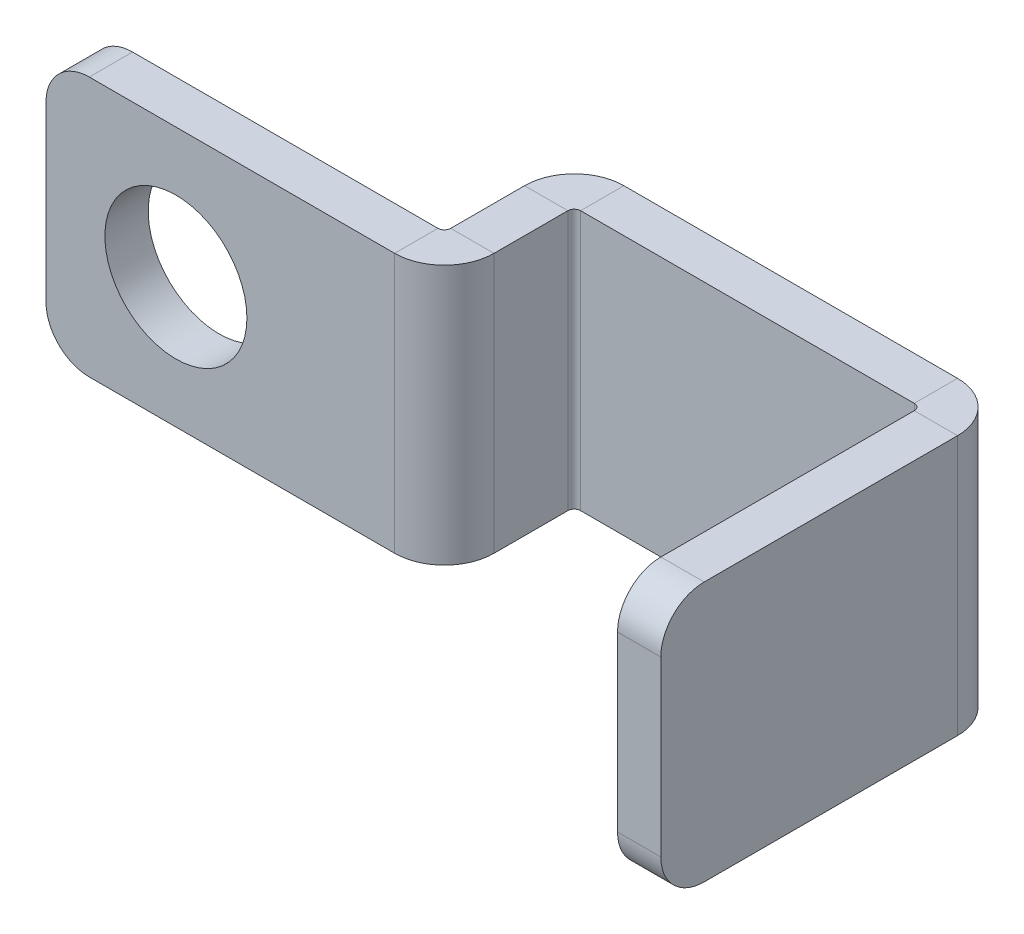
ISO-10303-21;
HEADER;
FILE_DESCRIPTION(('STEP AP214'),'2;1');
FILE_NAME('part.step','',(''),(''),'','','');
FILE_SCHEMA(('AUTOMOTIVE_DESIGN { 1 0 10303 214 1 1 1 1 }'));
ENDSEC;
DATA;
#1=APPLICATION_CONTEXT('core data for automotive mechanical design processes');
#2=APPLICATION_PROTOCOL_DEFINITION('international standard','automotive_design',2000,#1);
#3=PRODUCT_CONTEXT('',#1,'mechanical');
#4=PRODUCT('Part','Part','',(#3));
#5=PRODUCT_RELATED_PRODUCT_CATEGORY('part','',(#4));
#6=PRODUCT_DEFINITION_FORMATION('','',#4);
#7=PRODUCT_DEFINITION_CONTEXT('part definition',#1,'design');
#8=PRODUCT_DEFINITION('design','',#6,#7);
#9=PRODUCT_DEFINITION_SHAPE('','',#8);
#10=(LENGTH_UNIT() NAMED_UNIT(*) SI_UNIT(.MILLI.,.METRE.));
#11=(NAMED_UNIT(*) PLANE_ANGLE_UNIT() SI_UNIT($,.RADIAN.));
#12=(NAMED_UNIT(*) SI_UNIT($,.STERADIAN.) SOLID_ANGLE_UNIT());
#13=UNCERTAINTY_MEASURE_WITH_UNIT(LENGTH_MEASURE(1.E-05),#10,'distance_accuracy_value','');
#14=(GEOMETRIC_REPRESENTATION_CONTEXT(3) GLOBAL_UNCERTAINTY_ASSIGNED_CONTEXT((#13)) GLOBAL_UNIT_ASSIGNED_CONTEXT((#10,
#11,#12)) REPRESENTATION_CONTEXT('',''));
#15=CARTESIAN_POINT('',(0.,0.,0.));
#16=DIRECTION('',(0.,0.,1.));
#17=DIRECTION('',(1.,0.,0.));
#18=AXIS2_PLACEMENT_3D('',#15,#16,#17);
#19=CARTESIAN_POINT('',(23.,-15.,-20.));
#20=DIRECTION('',(0.,1.,0.));
#21=DIRECTION('',(0.,0.,1.));
#22=AXIS2_PLACEMENT_3D('',#19,#20,#21);
#23=PLANE('',#22);
#24=DIRECTION('',(0.,0.,-1.));
#25=VECTOR('',#24,1.);
#26=CARTESIAN_POINT('',(62.2634,-15.,-15.));
#27=LINE('',#26,#25);
#28=CARTESIAN_POINT('',(62.2634,-15.,-15.));
#29=VERTEX_POINT('',#28);
#30=CARTESIAN_POINT('',(62.2634,-15.,-20.));
#31=VERTEX_POINT('',#30);
#32=EDGE_CURVE('E297',#29,#31,#27,.T.);
#33=ORIENTED_EDGE('',*,*,#32,.F.);
#34=DIRECTION('',(1.,0.,0.));
#35=VECTOR('',#34,1.);
#36=CARTESIAN_POINT('',(23.,-15.,-15.));
#37=LINE('',#36,#35);
#38=CARTESIAN_POINT('',(23.7366,-15.,-15.));
#39=VERTEX_POINT('',#38);
#40=EDGE_CURVE('E311',#29,#39,#37,.F.);
#41=ORIENTED_EDGE('',*,*,#40,.T.);
#42=DIRECTION('',(0.,0.,1.));
#43=VECTOR('',#42,1.);
#44=CARTESIAN_POINT('',(23.7366,-15.,-20.));
#45=LINE('',#44,#43);
#46=CARTESIAN_POINT('',(23.7366,-15.,-20.));
#47=VERTEX_POINT('',#46);
#48=EDGE_CURVE('E300',#39,#47,#45,.F.);
#49=ORIENTED_EDGE('',*,*,#48,.T.);
#50=DIRECTION('',(-1.,0.,0.));
#51=VECTOR('',#50,1.);
#52=CARTESIAN_POINT('',(0.,-15.,-20.));
#53=LINE('',#52,#51);
#54=EDGE_CURVE('E306',#31,#47,#53,.T.);
#55=ORIENTED_EDGE('',*,*,#54,.F.);
#56=EDGE_LOOP('',(#33,#41,#49,#55));
#57=FACE_BOUND('',#56,.T.);
#58=ADVANCED_FACE('F97',(#57),#23,.F.);
#59=CARTESIAN_POINT('',(68.,15.,-20.));
#60=DIRECTION('',(0.,-1.,0.));
#61=DIRECTION('',(0.,0.,-1.));
#62=AXIS2_PLACEMENT_3D('',#59,#60,#61);
#63=PLANE('',#62);
#64=DIRECTION('',(0.,0.,-1.));
#65=VECTOR('',#64,1.);
#66=CARTESIAN_POINT('',(62.2634,15.,-15.));
#67=LINE('',#66,#65);
#68=CARTESIAN_POINT('',(62.2634,15.,-15.));
#69=VERTEX_POINT('',#68);
#70=CARTESIAN_POINT('',(62.2634,15.,-20.));
#71=VERTEX_POINT('',#70);
#72=EDGE_CURVE('E289',#69,#71,#67,.T.);
#73=ORIENTED_EDGE('',*,*,#72,.T.);
#74=DIRECTION('',(1.,0.,0.));
#75=VECTOR('',#74,1.);
#76=CARTESIAN_POINT('',(0.,15.,-20.));
#77=LINE('',#76,#75);
#78=CARTESIAN_POINT('',(23.7366,15.,-20.));
#79=VERTEX_POINT('',#78);
#80=EDGE_CURVE('E303',#79,#71,#77,.T.);
#81=ORIENTED_EDGE('',*,*,#80,.F.);
#82=DIRECTION('',(0.,0.,1.));
#83=VECTOR('',#82,1.);
#84=CARTESIAN_POINT('',(23.7366,15.,-15.));
#85=LINE('',#84,#83);
#86=CARTESIAN_POINT('',(23.7366,15.,-15.));
#87=VERTEX_POINT('',#86);
#88=EDGE_CURVE('E316',#87,#79,#85,.F.);
#89=ORIENTED_EDGE('',*,*,#88,.F.);
#90=DIRECTION('',(-1.,0.,0.));
#91=VECTOR('',#90,1.);
#92=CARTESIAN_POINT('',(68.,15.,-15.));
#93=LINE('',#92,#91);
#94=EDGE_CURVE('E308',#87,#69,#93,.F.);
#95=ORIENTED_EDGE('',*,*,#94,.T.);
#96=EDGE_LOOP('',(#73,#81,#89,#95));
#97=FACE_BOUND('',#96,.T.);
#98=ADVANCED_FACE('F502',(#97),#63,.F.);
#99=CARTESIAN_POINT('',(0.,0.,-20.));
#100=DIRECTION('',(0.,0.,1.));
#101=DIRECTION('',(1.,0.,0.));
#102=AXIS2_PLACEMENT_3D('',#99,#100,#101);
#103=PLANE('',#102);
#104=DIRECTION('',(0.,1.,0.));
#105=VECTOR('',#104,1.);
#106=CARTESIAN_POINT('',(62.2634,15.,-20.));
#107=LINE('',#106,#105);
#108=EDGE_CURVE('E242',#71,#31,#107,.F.);
#109=ORIENTED_EDGE('',*,*,#108,.T.);
#110=ORIENTED_EDGE('',*,*,#54,.T.);
#111=DIRECTION('',(0.,1.,0.));
#112=VECTOR('',#111,1.);
#113=CARTESIAN_POINT('',(23.7366,-15.,-20.));
#114=LINE('',#113,#112);
#115=EDGE_CURVE('E313',#79,#47,#114,.F.);
#116=ORIENTED_EDGE('',*,*,#115,.F.);
#117=ORIENTED_EDGE('',*,*,#80,.T.);
#118=EDGE_LOOP('',(#109,#110,#116,#117));
#119=FACE_BOUND('',#118,.T.);
#120=ADVANCED_FACE('F533',(#119),#103,.F.);
#121=CARTESIAN_POINT('',(0.,0.,-15.));
#122=DIRECTION('',(0.,0.,1.));
#123=DIRECTION('',(1.,0.,0.));
#124=AXIS2_PLACEMENT_3D('',#121,#122,#123);
#125=PLANE('',#124);
#126=ORIENTED_EDGE('',*,*,#40,.F.);
#127=DIRECTION('',(0.,1.,0.));
#128=VECTOR('',#127,1.);
#129=CARTESIAN_POINT('',(62.2634,15.,-15.));
#130=LINE('',#129,#128);
#131=EDGE_CURVE('E293',#69,#29,#130,.F.);
#132=ORIENTED_EDGE('',*,*,#131,.F.);
#133=ORIENTED_EDGE('',*,*,#94,.F.);
#134=DIRECTION('',(0.,1.,0.));
#135=VECTOR('',#134,1.);
#136=CARTESIAN_POINT('',(23.7366,-15.,-15.));
#137=LINE('',#136,#135);
#138=EDGE_CURVE('E319',#39,#87,#137,.T.);
#139=ORIENTED_EDGE('',*,*,#138,.F.);
#140=EDGE_LOOP('',(#126,#132,#133,#139));
#141=FACE_BOUND('',#140,.T.);
#142=ADVANCED_FACE('F500',(#141),#125,.T.);
#143=CARTESIAN_POINT('',(23.,-15.,-20.));
#144=DIRECTION('',(0.,1.,0.));
#145=DIRECTION('',(0.,0.,1.));
#146=AXIS2_PLACEMENT_3D('',#143,#144,#145);
#147=PLANE('',#146);
#148=DIRECTION('',(-1.,0.,0.));
#149=VECTOR('',#148,1.);
#150=CARTESIAN_POINT('',(23.,-15.,-14.2634));
#151=LINE('',#150,#149);
#152=CARTESIAN_POINT('',(23.,-15.,-14.2634));
#153=VERTEX_POINT('',#152);
#154=CARTESIAN_POINT('',(18.,-15.,-14.2634));
#155=VERTEX_POINT('',#154);
#156=EDGE_CURVE('E340',#153,#155,#151,.T.);
#157=ORIENTED_EDGE('',*,*,#156,.F.);
#158=DIRECTION('',(0.,0.,-1.));
#159=VECTOR('',#158,1.);
#160=CARTESIAN_POINT('',(23.,-15.,1.07663027445009E-13));
#161=LINE('',#160,#159);
#162=CARTESIAN_POINT('',(23.,-15.,-5.73659999999998));
#163=VERTEX_POINT('',#162);
#164=EDGE_CURVE('E349',#163,#153,#161,.T.);
#165=ORIENTED_EDGE('',*,*,#164,.F.);
#166=DIRECTION('',(-1.,0.,0.));
#167=VECTOR('',#166,1.);
#168=CARTESIAN_POINT('',(18.,-15.,-5.7366));
#169=LINE('',#168,#167);
#170=CARTESIAN_POINT('',(18.,-15.,-5.7366));
#171=VERTEX_POINT('',#170);
#172=EDGE_CURVE('E360',#171,#163,#169,.F.);
#173=ORIENTED_EDGE('',*,*,#172,.F.);
#174=DIRECTION('',(0.,0.,1.));
#175=VECTOR('',#174,1.);
#176=CARTESIAN_POINT('',(18.,-15.,-20.));
#177=LINE('',#176,#175);
#178=EDGE_CURVE('E354',#171,#155,#177,.F.);
#179=ORIENTED_EDGE('',*,*,#178,.T.);
#180=EDGE_LOOP('',(#157,#165,#173,#179));
#181=FACE_BOUND('',#180,.T.);
#182=ADVANCED_FACE('F475',(#181),#147,.F.);
#183=CARTESIAN_POINT('',(23.,15.,-4.99999999999998));
#184=DIRECTION('',(0.,-1.,0.));
#185=DIRECTION('',(0.,0.,-1.));
#186=AXIS2_PLACEMENT_3D('',#183,#184,#185);
#187=PLANE('',#186);
#188=DIRECTION('',(-1.,0.,0.));
#189=VECTOR('',#188,1.);
#190=CARTESIAN_POINT('',(23.,15.,-14.2634));
#191=LINE('',#190,#189);
#192=CARTESIAN_POINT('',(23.,15.,-14.2634));
#193=VERTEX_POINT('',#192);
#194=CARTESIAN_POINT('',(18.,15.,-14.2633999999999));
#195=VERTEX_POINT('',#194);
#196=EDGE_CURVE('E330',#193,#195,#191,.T.);
#197=ORIENTED_EDGE('',*,*,#196,.T.);
#198=DIRECTION('',(0.,0.,-1.));
#199=VECTOR('',#198,1.);
#200=CARTESIAN_POINT('',(18.,15.,-5.));
#201=LINE('',#200,#199);
#202=CARTESIAN_POINT('',(18.,15.,-5.7366));
#203=VERTEX_POINT('',#202);
#204=EDGE_CURVE('E352',#195,#203,#201,.F.);
#205=ORIENTED_EDGE('',*,*,#204,.T.);
#206=DIRECTION('',(-1.,0.,0.));
#207=VECTOR('',#206,1.);
#208=CARTESIAN_POINT('',(23.,15.,-5.73659999999998));
#209=LINE('',#208,#207);
#210=CARTESIAN_POINT('',(23.,15.,-5.73659999999998));
#211=VERTEX_POINT('',#210);
#212=EDGE_CURVE('E343',#203,#211,#209,.F.);
#213=ORIENTED_EDGE('',*,*,#212,.T.);
#214=DIRECTION('',(0.,0.,1.));
#215=VECTOR('',#214,1.);
#216=CARTESIAN_POINT('',(23.,15.,0.));
#217=LINE('',#216,#215);
#218=EDGE_CURVE('E346',#193,#211,#217,.T.);
#219=ORIENTED_EDGE('',*,*,#218,.F.);
#220=EDGE_LOOP('',(#197,#205,#213,#219));
#221=FACE_BOUND('',#220,.T.);
#222=ADVANCED_FACE('F488',(#221),#187,.F.);
#223=CARTESIAN_POINT('',(23.,0.,0.));
#224=DIRECTION('',(-1.,0.,0.));
#225=DIRECTION('',(0.,0.,1.));
#226=AXIS2_PLACEMENT_3D('',#223,#224,#225);
#227=PLANE('',#226);
#228=DIRECTION('',(0.,1.,0.));
#229=VECTOR('',#228,1.);
#230=CARTESIAN_POINT('',(23.,15.,-14.2634));
#231=LINE('',#230,#229);
#232=EDGE_CURVE('E336',#193,#153,#231,.F.);
#233=ORIENTED_EDGE('',*,*,#232,.F.);
#234=ORIENTED_EDGE('',*,*,#218,.T.);
#235=DIRECTION('',(0.,-1.,0.));
#236=VECTOR('',#235,1.);
#237=CARTESIAN_POINT('',(23.,15.,-5.73659999999998));
#238=LINE('',#237,#236);
#239=EDGE_CURVE('E357',#163,#211,#238,.F.);
#240=ORIENTED_EDGE('',*,*,#239,.F.);
#241=ORIENTED_EDGE('',*,*,#164,.T.);
#242=EDGE_LOOP('',(#233,#234,#240,#241));
#243=FACE_BOUND('',#242,.T.);
#244=ADVANCED_FACE('F480',(#243),#227,.F.);
#245=CARTESIAN_POINT('',(18.,0.,0.));
#246=DIRECTION('',(-1.,0.,0.));
#247=DIRECTION('',(0.,0.,1.));
#248=AXIS2_PLACEMENT_3D('',#245,#246,#247);
#249=PLANE('',#248);
#250=ORIENTED_EDGE('',*,*,#204,.F.);
#251=DIRECTION('',(0.,1.,0.));
#252=VECTOR('',#251,1.);
#253=CARTESIAN_POINT('',(18.,15.,-14.2633999999999));
#254=LINE('',#253,#252);
#255=EDGE_CURVE('E323',#195,#155,#254,.F.);
#256=ORIENTED_EDGE('',*,*,#255,.T.);
#257=ORIENTED_EDGE('',*,*,#178,.F.);
#258=DIRECTION('',(0.,-1.,0.));
#259=VECTOR('',#258,1.);
#260=CARTESIAN_POINT('',(18.,15.,-5.7366));
#261=LINE('',#260,#259);
#262=EDGE_CURVE('E363',#203,#171,#261,.T.);
#263=ORIENTED_EDGE('',*,*,#262,.F.);
#264=EDGE_LOOP('',(#250,#256,#257,#263));
#265=FACE_BOUND('',#264,.T.);
#266=ADVANCED_FACE('F472',(#265),#249,.T.);
#267=CARTESIAN_POINT('',(23.,-15.,-5.));
#268=DIRECTION('',(0.,-1.,0.));
#269=DIRECTION('',(1.,0.,0.));
#270=AXIS2_PLACEMENT_3D('',#267,#268,#269);
#271=PLANE('',#270);
#272=DIRECTION('',(1.,0.,0.));
#273=VECTOR('',#272,1.);
#274=CARTESIAN_POINT('',(23.,-15.,0.));
#275=LINE('',#274,#273);
#276=CARTESIAN_POINT('',(-18.,-15.,0.));
#277=VERTEX_POINT('',#276);
#278=CARTESIAN_POINT('',(17.2634,-15.,0.));
#279=VERTEX_POINT('',#278);
#280=EDGE_CURVE('E407',#277,#279,#275,.T.);
#281=ORIENTED_EDGE('',*,*,#280,.F.);
#282=DIRECTION('',(0.,0.,1.));
#283=VECTOR('',#282,1.);
#284=CARTESIAN_POINT('',(-18.,-15.,-5.));
#285=LINE('',#284,#283);
#286=CARTESIAN_POINT('',(-18.,-15.,-5.));
#287=VERTEX_POINT('',#286);
#288=EDGE_CURVE('E13',#277,#287,#285,.F.);
#289=ORIENTED_EDGE('',*,*,#288,.T.);
#290=DIRECTION('',(1.,0.,0.));
#291=VECTOR('',#290,1.);
#292=CARTESIAN_POINT('',(23.,-15.,-5.));
#293=LINE('',#292,#291);
#294=CARTESIAN_POINT('',(17.2634,-15.,-5.));
#295=VERTEX_POINT('',#294);
#296=EDGE_CURVE('E398',#287,#295,#293,.T.);
#297=ORIENTED_EDGE('',*,*,#296,.T.);
#298=DIRECTION('',(0.,0.,1.));
#299=VECTOR('',#298,1.);
#300=CARTESIAN_POINT('',(17.2634,-15.,-5.));
#301=LINE('',#300,#299);
#302=EDGE_CURVE('E374',#295,#279,#301,.T.);
#303=ORIENTED_EDGE('',*,*,#302,.T.);
#304=EDGE_LOOP('',(#281,#289,#297,#303));
#305=FACE_BOUND('',#304,.T.);
#306=ADVANCED_FACE('F459',(#305),#271,.T.);
#307=CARTESIAN_POINT('',(0.,0.,-5.));
#308=DIRECTION('',(0.,0.,1.));
#309=DIRECTION('',(1.,0.,0.));
#310=AXIS2_PLACEMENT_3D('',#307,#308,#309);
#311=PLANE('',#310);
#312=CARTESIAN_POINT('',(-8.,0.,-5.));
#313=DIRECTION('',(0.,0.,1.));
#314=DIRECTION('',(1.,0.,0.));
#315=AXIS2_PLACEMENT_3D('',#312,#313,#314);
#316=CIRCLE('',#315,8.2);
#317=CARTESIAN_POINT('',(0.199999999999999,0.,-5.));
#318=VERTEX_POINT('',#317);
#319=EDGE_CURVE('E390',#318,#318,#316,.T.);
#320=ORIENTED_EDGE('',*,*,#319,.T.);
#321=EDGE_LOOP('',(#320));
#322=FACE_BOUND('',#321,.T.);
#323=DIRECTION('',(0.,-1.,0.));
#324=VECTOR('',#323,1.);
#325=CARTESIAN_POINT('',(-23.,-15.,-5.));
#326=LINE('',#325,#324);
#327=CARTESIAN_POINT('',(-23.,10.,-5.));
#328=VERTEX_POINT('',#327);
#329=CARTESIAN_POINT('',(-23.,-10.,-5.));
#330=VERTEX_POINT('',#329);
#331=EDGE_CURVE('E396',#328,#330,#326,.T.);
#332=ORIENTED_EDGE('',*,*,#331,.F.);
#333=CARTESIAN_POINT('',(-18.,10.,-5.));
#334=DIRECTION('',(0.,0.,1.));
#335=DIRECTION('',(1.,0.,0.));
#336=AXIS2_PLACEMENT_3D('',#333,#334,#335);
#337=CIRCLE('',#336,5.);
#338=CARTESIAN_POINT('',(-18.,15.,-5.));
#339=VERTEX_POINT('',#338);
#340=EDGE_CURVE('E105',#328,#339,#337,.F.);
#341=ORIENTED_EDGE('',*,*,#340,.T.);
#342=DIRECTION('',(-1.,0.,0.));
#343=VECTOR('',#342,1.);
#344=CARTESIAN_POINT('',(23.,15.,-5.));
#345=LINE('',#344,#343);
#346=CARTESIAN_POINT('',(17.2634,15.,-5.));
#347=VERTEX_POINT('',#346);
#348=EDGE_CURVE('E401',#347,#339,#345,.T.);
#349=ORIENTED_EDGE('',*,*,#348,.F.);
#350=DIRECTION('',(0.,-1.,0.));
#351=VECTOR('',#350,1.);
#352=CARTESIAN_POINT('',(17.2634,-15.,-5.));
#353=LINE('',#352,#351);
#354=EDGE_CURVE('E380',#295,#347,#353,.F.);
#355=ORIENTED_EDGE('',*,*,#354,.F.);
#356=ORIENTED_EDGE('',*,*,#296,.F.);
#357=CARTESIAN_POINT('',(-18.,-10.,-5.));
#358=DIRECTION('',(0.,0.,1.));
#359=DIRECTION('',(1.,0.,0.));
#360=AXIS2_PLACEMENT_3D('',#357,#358,#359);
#361=CIRCLE('',#360,5.);
#362=EDGE_CURVE('E117',#287,#330,#361,.F.);
#363=ORIENTED_EDGE('',*,*,#362,.T.);
#364=EDGE_LOOP('',(#332,#341,#349,#355,#356,#363));
#365=FACE_BOUND('',#364,.T.);
#366=ADVANCED_FACE('F441',(#322,#365),#311,.F.);
#367=CARTESIAN_POINT('',(0.,0.,0.));
#368=DIRECTION('',(0.,0.,1.));
#369=DIRECTION('',(1.,0.,0.));
#370=AXIS2_PLACEMENT_3D('',#367,#368,#369);
#371=PLANE('',#370);
#372=CARTESIAN_POINT('',(-8.,0.,0.));
#373=DIRECTION('',(0.,0.,1.));
#374=DIRECTION('',(1.,0.,0.));
#375=AXIS2_PLACEMENT_3D('',#372,#373,#374);
#376=CIRCLE('',#375,8.2);
#377=CARTESIAN_POINT('',(0.199999999999999,0.,0.));
#378=VERTEX_POINT('',#377);
#379=EDGE_CURVE('E387',#378,#378,#376,.T.);
#380=ORIENTED_EDGE('',*,*,#379,.F.);
#381=EDGE_LOOP('',(#380));
#382=FACE_BOUND('',#381,.T.);
#383=DIRECTION('',(-1.,0.,0.));
#384=VECTOR('',#383,1.);
#385=CARTESIAN_POINT('',(23.,15.,0.));
#386=LINE('',#385,#384);
#387=CARTESIAN_POINT('',(17.2634,15.,0.));
#388=VERTEX_POINT('',#387);
#389=CARTESIAN_POINT('',(-18.,15.,0.));
#390=VERTEX_POINT('',#389);
#391=EDGE_CURVE('E399',#388,#390,#386,.T.);
#392=ORIENTED_EDGE('',*,*,#391,.T.);
#393=CARTESIAN_POINT('',(-18.,10.,0.));
#394=DIRECTION('',(0.,0.,1.));
#395=DIRECTION('',(1.,0.,0.));
#396=AXIS2_PLACEMENT_3D('',#393,#394,#395);
#397=CIRCLE('',#396,5.);
#398=CARTESIAN_POINT('',(-23.,10.,0.));
#399=VERTEX_POINT('',#398);
#400=EDGE_CURVE('E432',#390,#399,#397,.T.);
#401=ORIENTED_EDGE('',*,*,#400,.T.);
#402=DIRECTION('',(0.,-1.,0.));
#403=VECTOR('',#402,1.);
#404=CARTESIAN_POINT('',(-23.,-15.,0.));
#405=LINE('',#404,#403);
#406=CARTESIAN_POINT('',(-23.,-10.,0.));
#407=VERTEX_POINT('',#406);
#408=EDGE_CURVE('E393',#399,#407,#405,.T.);
#409=ORIENTED_EDGE('',*,*,#408,.T.);
#410=CARTESIAN_POINT('',(-18.,-10.,0.));
#411=DIRECTION('',(0.,0.,1.));
#412=DIRECTION('',(1.,0.,0.));
#413=AXIS2_PLACEMENT_3D('',#410,#411,#412);
#414=CIRCLE('',#413,5.);
#415=EDGE_CURVE('E430',#407,#277,#414,.T.);
#416=ORIENTED_EDGE('',*,*,#415,.T.);
#417=ORIENTED_EDGE('',*,*,#280,.T.);
#418=DIRECTION('',(0.,-1.,0.));
#419=VECTOR('',#418,1.);
#420=CARTESIAN_POINT('',(17.2634,-15.,0.));
#421=LINE('',#420,#419);
#422=EDGE_CURVE('E367',#279,#388,#421,.F.);
#423=ORIENTED_EDGE('',*,*,#422,.T.);
#424=EDGE_LOOP('',(#392,#401,#409,#416,#417,#423));
#425=FACE_BOUND('',#424,.T.);
#426=ADVANCED_FACE('F453',(#382,#425),#371,.T.);
#427=CARTESIAN_POINT('',(-23.,-15.,-5.));
#428=DIRECTION('',(-1.,0.,0.));
#429=DIRECTION('',(0.,0.,1.));
#430=AXIS2_PLACEMENT_3D('',#427,#428,#429);
#431=PLANE('',#430);
#432=ORIENTED_EDGE('',*,*,#408,.F.);
#433=DIRECTION('',(0.,0.,1.));
#434=VECTOR('',#433,1.);
#435=CARTESIAN_POINT('',(-23.,10.,-5.));
#436=LINE('',#435,#434);
#437=EDGE_CURVE('E437',#399,#328,#436,.F.);
#438=ORIENTED_EDGE('',*,*,#437,.T.);
#439=ORIENTED_EDGE('',*,*,#331,.T.);
#440=DIRECTION('',(0.,0.,1.));
#441=VECTOR('',#440,1.);
#442=CARTESIAN_POINT('',(-23.,-10.,-5.));
#443=LINE('',#442,#441);
#444=EDGE_CURVE('E434',#330,#407,#443,.T.);
#445=ORIENTED_EDGE('',*,*,#444,.T.);
#446=EDGE_LOOP('',(#432,#438,#439,#445));
#447=FACE_BOUND('',#446,.T.);
#448=ADVANCED_FACE('F455',(#447),#431,.T.);
#449=CARTESIAN_POINT('',(23.,15.,-5.));
#450=DIRECTION('',(0.,1.,0.));
#451=DIRECTION('',(-1.,0.,0.));
#452=AXIS2_PLACEMENT_3D('',#449,#450,#451);
#453=PLANE('',#452);
#454=ORIENTED_EDGE('',*,*,#348,.T.);
#455=DIRECTION('',(0.,0.,1.));
#456=VECTOR('',#455,1.);
#457=CARTESIAN_POINT('',(-18.,15.,-5.));
#458=LINE('',#457,#456);
#459=EDGE_CURVE('E427',#339,#390,#458,.T.);
#460=ORIENTED_EDGE('',*,*,#459,.T.);
#461=ORIENTED_EDGE('',*,*,#391,.F.);
#462=DIRECTION('',(0.,0.,1.));
#463=VECTOR('',#462,1.);
#464=CARTESIAN_POINT('',(17.2634,15.,-5.));
#465=LINE('',#464,#463);
#466=EDGE_CURVE('E384',#347,#388,#465,.T.);
#467=ORIENTED_EDGE('',*,*,#466,.F.);
#468=EDGE_LOOP('',(#454,#460,#461,#467));
#469=FACE_BOUND('',#468,.T.);
#470=ADVANCED_FACE('F448',(#469),#453,.T.);
#471=CARTESIAN_POINT('',(-8.,0.,-5.));
#472=DIRECTION('',(0.,0.,1.));
#473=DIRECTION('',(1.,0.,0.));
#474=AXIS2_PLACEMENT_3D('',#471,#472,#473);
#475=CYLINDRICAL_SURFACE('',#474,8.2);
#476=ORIENTED_EDGE('',*,*,#319,.F.);
#477=EDGE_LOOP('',(#476));
#478=FACE_BOUND('',#477,.T.);
#479=ORIENTED_EDGE('',*,*,#379,.T.);
#480=EDGE_LOOP('',(#479));
#481=FACE_BOUND('',#480,.T.);
#482=ADVANCED_FACE('F584',(#478,#481),#475,.F.);
#483=CARTESIAN_POINT('',(17.2634,15.,-5.7366));
#484=DIRECTION('',(0.,1.,0.));
#485=DIRECTION('',(0.,0.,1.));
#486=AXIS2_PLACEMENT_3D('',#483,#484,#485);
#487=PLANE('',#486);
#488=ORIENTED_EDGE('',*,*,#212,.F.);
#489=CARTESIAN_POINT('',(17.2634,15.,-5.7366));
#490=DIRECTION('',(0.,-1.,0.));
#491=DIRECTION('',(0.,0.,-1.));
#492=AXIS2_PLACEMENT_3D('',#489,#490,#491);
#493=CIRCLE('',#492,0.7366);
#494=EDGE_CURVE('E377',#347,#203,#493,.F.);
#495=ORIENTED_EDGE('',*,*,#494,.F.);
#496=ORIENTED_EDGE('',*,*,#466,.T.);
#497=CARTESIAN_POINT('',(17.2634,15.,-5.7366));
#498=DIRECTION('',(0.,-1.,0.));
#499=DIRECTION('',(0.,0.,-1.));
#500=AXIS2_PLACEMENT_3D('',#497,#498,#499);
#501=CIRCLE('',#500,5.7366);
#502=EDGE_CURVE('E370',#388,#211,#501,.F.);
#503=ORIENTED_EDGE('',*,*,#502,.T.);
#504=EDGE_LOOP('',(#488,#495,#496,#503));
#505=FACE_BOUND('',#504,.T.);
#506=ADVANCED_FACE('F486',(#505),#487,.T.);
#507=CARTESIAN_POINT('',(17.2634,-15.,-5.7366));
#508=DIRECTION('',(0.,1.,0.));
#509=DIRECTION('',(0.,0.,1.));
#510=AXIS2_PLACEMENT_3D('',#507,#508,#509);
#511=PLANE('',#510);
#512=CARTESIAN_POINT('',(17.2634,-15.,-5.7366));
#513=DIRECTION('',(0.,-1.,0.));
#514=DIRECTION('',(0.,0.,-1.));
#515=AXIS2_PLACEMENT_3D('',#512,#513,#514);
#516=CIRCLE('',#515,0.7366);
#517=EDGE_CURVE('E348',#171,#295,#516,.T.);
#518=ORIENTED_EDGE('',*,*,#517,.F.);
#519=ORIENTED_EDGE('',*,*,#172,.T.);
#520=CARTESIAN_POINT('',(17.2634,-15.,-5.7366));
#521=DIRECTION('',(0.,-1.,0.));
#522=DIRECTION('',(0.,0.,-1.));
#523=AXIS2_PLACEMENT_3D('',#520,#521,#522);
#524=CIRCLE('',#523,5.7366);
#525=EDGE_CURVE('E371',#163,#279,#524,.T.);
#526=ORIENTED_EDGE('',*,*,#525,.T.);
#527=ORIENTED_EDGE('',*,*,#302,.F.);
#528=EDGE_LOOP('',(#518,#519,#526,#527));
#529=FACE_BOUND('',#528,.T.);
#530=ADVANCED_FACE('F463',(#529),#511,.F.);
#531=CARTESIAN_POINT('',(17.2634,-15.,-5.7366));
#532=DIRECTION('',(0.,-1.,0.));
#533=DIRECTION('',(1.,0.,0.));
#534=AXIS2_PLACEMENT_3D('',#531,#532,#533);
#535=CYLINDRICAL_SURFACE('',#534,5.7366);
#536=ORIENTED_EDGE('',*,*,#422,.F.);
#537=ORIENTED_EDGE('',*,*,#525,.F.);
#538=ORIENTED_EDGE('',*,*,#239,.T.);
#539=ORIENTED_EDGE('',*,*,#502,.F.);
#540=EDGE_LOOP('',(#536,#537,#538,#539));
#541=FACE_BOUND('',#540,.T.);
#542=ADVANCED_FACE('F483',(#541),#535,.T.);
#543=CARTESIAN_POINT('',(17.2634,-15.,-5.7366));
#544=DIRECTION('',(0.,-1.,0.));
#545=DIRECTION('',(1.,0.,0.));
#546=AXIS2_PLACEMENT_3D('',#543,#544,#545);
#547=CYLINDRICAL_SURFACE('',#546,0.7366);
#548=ORIENTED_EDGE('',*,*,#354,.T.);
#549=ORIENTED_EDGE('',*,*,#494,.T.);
#550=ORIENTED_EDGE('',*,*,#262,.T.);
#551=ORIENTED_EDGE('',*,*,#517,.T.);
#552=EDGE_LOOP('',(#548,#549,#550,#551));
#553=FACE_BOUND('',#552,.T.);
#554=ADVANCED_FACE('F466',(#553),#547,.F.);
#555=CARTESIAN_POINT('',(23.7366,-15.,-14.2634));
#556=DIRECTION('',(0.,-1.,0.));
#557=DIRECTION('',(0.,0.,-1.));
#558=AXIS2_PLACEMENT_3D('',#555,#556,#557);
#559=PLANE('',#558);
#560=ORIENTED_EDGE('',*,*,#48,.F.);
#561=CARTESIAN_POINT('',(23.7366,-15.,-14.2634));
#562=DIRECTION('',(0.,1.,0.));
#563=DIRECTION('',(0.,0.,1.));
#564=AXIS2_PLACEMENT_3D('',#561,#562,#563);
#565=CIRCLE('',#564,0.736600000000018);
#566=EDGE_CURVE('E333',#153,#39,#565,.F.);
#567=ORIENTED_EDGE('',*,*,#566,.F.);
#568=ORIENTED_EDGE('',*,*,#156,.T.);
#569=CARTESIAN_POINT('',(23.7366,-15.,-14.2634));
#570=DIRECTION('',(0.,1.,0.));
#571=DIRECTION('',(0.,0.,1.));
#572=AXIS2_PLACEMENT_3D('',#569,#570,#571);
#573=CIRCLE('',#572,5.73660000000002);
#574=EDGE_CURVE('E326',#155,#47,#573,.F.);
#575=ORIENTED_EDGE('',*,*,#574,.T.);
#576=EDGE_LOOP('',(#560,#567,#568,#575));
#577=FACE_BOUND('',#576,.T.);
#578=ADVANCED_FACE('F537',(#577),#559,.T.);
#579=CARTESIAN_POINT('',(23.7366,15.,-14.2634));
#580=DIRECTION('',(0.,-1.,0.));
#581=DIRECTION('',(0.,0.,-1.));
#582=AXIS2_PLACEMENT_3D('',#579,#580,#581);
#583=PLANE('',#582);
#584=CARTESIAN_POINT('',(23.7366,15.,-14.2634));
#585=DIRECTION('',(0.,1.,0.));
#586=DIRECTION('',(0.,0.,1.));
#587=AXIS2_PLACEMENT_3D('',#584,#585,#586);
#588=CIRCLE('',#587,0.736600000000018);
#589=EDGE_CURVE('E305',#87,#193,#588,.T.);
#590=ORIENTED_EDGE('',*,*,#589,.F.);
#591=ORIENTED_EDGE('',*,*,#88,.T.);
#592=CARTESIAN_POINT('',(23.7366,15.,-14.2634));
#593=DIRECTION('',(0.,1.,0.));
#594=DIRECTION('',(0.,0.,1.));
#595=AXIS2_PLACEMENT_3D('',#592,#593,#594);
#596=CIRCLE('',#595,5.73660000000002);
#597=EDGE_CURVE('E327',#79,#195,#596,.T.);
#598=ORIENTED_EDGE('',*,*,#597,.T.);
#599=ORIENTED_EDGE('',*,*,#196,.F.);
#600=EDGE_LOOP('',(#590,#591,#598,#599));
#601=FACE_BOUND('',#600,.T.);
#602=ADVANCED_FACE('F491',(#601),#583,.F.);
#603=CARTESIAN_POINT('',(23.7366,15.,-14.2634));
#604=DIRECTION('',(0.,1.,0.));
#605=DIRECTION('',(0.,0.,-1.));
#606=AXIS2_PLACEMENT_3D('',#603,#604,#605);
#607=CYLINDRICAL_SURFACE('',#606,5.73660000000002);
#608=ORIENTED_EDGE('',*,*,#255,.F.);
#609=ORIENTED_EDGE('',*,*,#597,.F.);
#610=ORIENTED_EDGE('',*,*,#115,.T.);
#611=ORIENTED_EDGE('',*,*,#574,.F.);
#612=EDGE_LOOP('',(#608,#609,#610,#611));
#613=FACE_BOUND('',#612,.T.);
#614=ADVANCED_FACE('F535',(#613),#607,.T.);
#615=CARTESIAN_POINT('',(23.7366,15.,-14.2634));
#616=DIRECTION('',(0.,1.,0.));
#617=DIRECTION('',(0.,0.,-1.));
#618=AXIS2_PLACEMENT_3D('',#615,#616,#617);
#619=CYLINDRICAL_SURFACE('',#618,0.736600000000018);
#620=ORIENTED_EDGE('',*,*,#232,.T.);
#621=ORIENTED_EDGE('',*,*,#566,.T.);
#622=ORIENTED_EDGE('',*,*,#138,.T.);
#623=ORIENTED_EDGE('',*,*,#589,.T.);
#624=EDGE_LOOP('',(#620,#621,#622,#623));
#625=FACE_BOUND('',#624,.T.);
#626=ADVANCED_FACE('F494',(#625),#619,.F.);
#627=CARTESIAN_POINT('',(62.2634,-15.,-14.2634));
#628=DIRECTION('',(0.,-1.,0.));
#629=DIRECTION('',(0.,0.,-1.));
#630=AXIS2_PLACEMENT_3D('',#627,#628,#629);
#631=PLANE('',#630);
#632=DIRECTION('',(-1.,0.,0.));
#633=VECTOR('',#632,1.);
#634=CARTESIAN_POINT('',(68.,-15.,-14.2634));
#635=LINE('',#634,#633);
#636=CARTESIAN_POINT('',(63.,-15.,-14.2634));
#637=VERTEX_POINT('',#636);
#638=CARTESIAN_POINT('',(68.,-15.,-14.2634));
#639=VERTEX_POINT('',#638);
#640=EDGE_CURVE('E284',#637,#639,#635,.F.);
#641=ORIENTED_EDGE('',*,*,#640,.F.);
#642=CARTESIAN_POINT('',(62.2634,-15.,-14.2634));
#643=DIRECTION('',(0.,1.,0.));
#644=DIRECTION('',(0.,0.,1.));
#645=AXIS2_PLACEMENT_3D('',#642,#643,#644);
#646=CIRCLE('',#645,0.736600000000004);
#647=EDGE_CURVE('E245',#29,#637,#646,.F.);
#648=ORIENTED_EDGE('',*,*,#647,.F.);
#649=ORIENTED_EDGE('',*,*,#32,.T.);
#650=CARTESIAN_POINT('',(62.2634,-15.,-14.2634));
#651=DIRECTION('',(0.,1.,0.));
#652=DIRECTION('',(0.,0.,1.));
#653=AXIS2_PLACEMENT_3D('',#650,#651,#652);
#654=CIRCLE('',#653,5.7366);
#655=EDGE_CURVE('E288',#31,#639,#654,.F.);
#656=ORIENTED_EDGE('',*,*,#655,.T.);
#657=EDGE_LOOP('',(#641,#648,#649,#656));
#658=FACE_BOUND('',#657,.T.);
#659=ADVANCED_FACE('F527',(#658),#631,.T.);
#660=CARTESIAN_POINT('',(62.2634,15.,-14.2634));
#661=DIRECTION('',(0.,-1.,0.));
#662=DIRECTION('',(0.,0.,-1.));
#663=AXIS2_PLACEMENT_3D('',#660,#661,#662);
#664=PLANE('',#663);
#665=CARTESIAN_POINT('',(62.2634,15.,-14.2634));
#666=DIRECTION('',(0.,1.,0.));
#667=DIRECTION('',(0.,0.,1.));
#668=AXIS2_PLACEMENT_3D('',#665,#666,#667);
#669=CIRCLE('',#668,0.736600000000004);
#670=CARTESIAN_POINT('',(63.,15.,-14.2634));
#671=VERTEX_POINT('',#670);
#672=EDGE_CURVE('E252',#671,#69,#669,.T.);
#673=ORIENTED_EDGE('',*,*,#672,.F.);
#674=DIRECTION('',(-1.,0.,0.));
#675=VECTOR('',#674,1.);
#676=CARTESIAN_POINT('',(63.,15.,-14.2634));
#677=LINE('',#676,#675);
#678=CARTESIAN_POINT('',(68.,15.,-14.2634));
#679=VERTEX_POINT('',#678);
#680=EDGE_CURVE('E249',#671,#679,#677,.F.);
#681=ORIENTED_EDGE('',*,*,#680,.T.);
#682=CARTESIAN_POINT('',(62.2634,15.,-14.2634));
#683=DIRECTION('',(0.,1.,0.));
#684=DIRECTION('',(0.,0.,1.));
#685=AXIS2_PLACEMENT_3D('',#682,#683,#684);
#686=CIRCLE('',#685,5.7366);
#687=EDGE_CURVE('E235',#679,#71,#686,.T.);
#688=ORIENTED_EDGE('',*,*,#687,.T.);
#689=ORIENTED_EDGE('',*,*,#72,.F.);
#690=EDGE_LOOP('',(#673,#681,#688,#689));
#691=FACE_BOUND('',#690,.T.);
#692=ADVANCED_FACE('F250',(#691),#664,.F.);
#693=CARTESIAN_POINT('',(62.2634,15.,-14.2634));
#694=DIRECTION('',(0.,1.,0.));
#695=DIRECTION('',(1.,0.,0.));
#696=AXIS2_PLACEMENT_3D('',#693,#694,#695);
#697=CYLINDRICAL_SURFACE('',#696,5.7366);
#698=ORIENTED_EDGE('',*,*,#108,.F.);
#699=ORIENTED_EDGE('',*,*,#687,.F.);
#700=DIRECTION('',(0.,1.,0.));
#701=VECTOR('',#700,1.);
#702=CARTESIAN_POINT('',(68.,-15.,-14.2634));
#703=LINE('',#702,#701);
#704=EDGE_CURVE('E240',#679,#639,#703,.F.);
#705=ORIENTED_EDGE('',*,*,#704,.T.);
#706=ORIENTED_EDGE('',*,*,#655,.F.);
#707=EDGE_LOOP('',(#698,#699,#705,#706));
#708=FACE_BOUND('',#707,.T.);
#709=ADVANCED_FACE('F237',(#708),#697,.T.);
#710=CARTESIAN_POINT('',(62.2634,15.,-14.2634));
#711=DIRECTION('',(0.,1.,0.));
#712=DIRECTION('',(1.,0.,0.));
#713=AXIS2_PLACEMENT_3D('',#710,#711,#712);
#714=CYLINDRICAL_SURFACE('',#713,0.736600000000004);
#715=ORIENTED_EDGE('',*,*,#131,.T.);
#716=ORIENTED_EDGE('',*,*,#647,.T.);
#717=DIRECTION('',(0.,1.,0.));
#718=VECTOR('',#717,1.);
#719=CARTESIAN_POINT('',(63.,-15.,-14.2634));
#720=LINE('',#719,#718);
#721=EDGE_CURVE('E257',#637,#671,#720,.T.);
#722=ORIENTED_EDGE('',*,*,#721,.T.);
#723=ORIENTED_EDGE('',*,*,#672,.T.);
#724=EDGE_LOOP('',(#715,#716,#722,#723));
#725=FACE_BOUND('',#724,.T.);
#726=ADVANCED_FACE('F505',(#725),#714,.F.);
#727=CARTESIAN_POINT('',(68.0000000000002,15.,20.));
#728=DIRECTION('',(0.,-1.,0.));
#729=DIRECTION('',(0.,0.,-1.));
#730=AXIS2_PLACEMENT_3D('',#727,#728,#729);
#731=PLANE('',#730);
#732=DIRECTION('',(0.,0.,-1.));
#733=VECTOR('',#732,1.);
#734=CARTESIAN_POINT('',(63.0000000000002,15.,20.));
#735=LINE('',#734,#733);
#736=CARTESIAN_POINT('',(63.0000000000002,15.,15.));
#737=VERTEX_POINT('',#736);
#738=EDGE_CURVE('E267',#671,#737,#735,.F.);
#739=ORIENTED_EDGE('',*,*,#738,.T.);
#740=DIRECTION('',(-1.,0.,0.));
#741=VECTOR('',#740,1.);
#742=CARTESIAN_POINT('',(68.0000000000002,15.,15.));
#743=LINE('',#742,#741);
#744=CARTESIAN_POINT('',(68.0000000000002,15.,15.));
#745=VERTEX_POINT('',#744);
#746=EDGE_CURVE('E271',#737,#745,#743,.F.);
#747=ORIENTED_EDGE('',*,*,#746,.T.);
#748=DIRECTION('',(0.,0.,1.));
#749=VECTOR('',#748,1.);
#750=CARTESIAN_POINT('',(68.0000000000001,15.,-2.60120439219429E-13));
#751=LINE('',#750,#749);
#752=EDGE_CURVE('E263',#679,#745,#751,.T.);
#753=ORIENTED_EDGE('',*,*,#752,.F.);
#754=ORIENTED_EDGE('',*,*,#680,.F.);
#755=EDGE_LOOP('',(#739,#747,#753,#754));
#756=FACE_BOUND('',#755,.T.);
#757=ADVANCED_FACE('F269',(#756),#731,.F.);
#758=CARTESIAN_POINT('',(68.,-15.,-15.));
#759=DIRECTION('',(0.,1.,0.));
#760=DIRECTION('',(0.,0.,1.));
#761=AXIS2_PLACEMENT_3D('',#758,#759,#760);
#762=PLANE('',#761);
#763=DIRECTION('',(0.,0.,-1.));
#764=VECTOR('',#763,1.);
#765=CARTESIAN_POINT('',(68.0000000000001,-15.,-2.60120439219429E-13));
#766=LINE('',#765,#764);
#767=CARTESIAN_POINT('',(68.0000000000002,-15.,15.));
#768=VERTEX_POINT('',#767);
#769=EDGE_CURVE('E266',#768,#639,#766,.T.);
#770=ORIENTED_EDGE('',*,*,#769,.F.);
#771=DIRECTION('',(-1.,0.,0.));
#772=VECTOR('',#771,1.);
#773=CARTESIAN_POINT('',(68.0000000000002,-15.,15.));
#774=LINE('',#773,#772);
#775=CARTESIAN_POINT('',(63.0000000000002,-15.,15.));
#776=VERTEX_POINT('',#775);
#777=EDGE_CURVE('E404',#768,#776,#774,.T.);
#778=ORIENTED_EDGE('',*,*,#777,.T.);
#779=DIRECTION('',(0.,0.,1.));
#780=VECTOR('',#779,1.);
#781=CARTESIAN_POINT('',(63.,-15.,-15.));
#782=LINE('',#781,#780);
#783=EDGE_CURVE('E273',#776,#637,#782,.F.);
#784=ORIENTED_EDGE('',*,*,#783,.T.);
#785=ORIENTED_EDGE('',*,*,#640,.T.);
#786=EDGE_LOOP('',(#770,#778,#784,#785));
#787=FACE_BOUND('',#786,.T.);
#788=ADVANCED_FACE('F524',(#787),#762,.F.);
#789=CARTESIAN_POINT('',(68.0000000000001,0.,-2.60120439219429E-13));
#790=DIRECTION('',(-1.,0.,0.));
#791=DIRECTION('',(0.,0.,1.));
#792=AXIS2_PLACEMENT_3D('',#789,#790,#791);
#793=PLANE('',#792);
#794=DIRECTION('',(0.,-1.,0.));
#795=VECTOR('',#794,1.);
#796=CARTESIAN_POINT('',(68.0000000000002,0.,20.));
#797=LINE('',#796,#795);
#798=CARTESIAN_POINT('',(68.0000000000002,9.99999999999999,20.));
#799=VERTEX_POINT('',#798);
#800=CARTESIAN_POINT('',(68.0000000000002,-10.,20.));
#801=VERTEX_POINT('',#800);
#802=EDGE_CURVE('E272',#799,#801,#797,.T.);
#803=ORIENTED_EDGE('',*,*,#802,.T.);
#804=CARTESIAN_POINT('',(68.0000000000002,-10.,15.));
#805=DIRECTION('',(-1.,0.,0.));
#806=DIRECTION('',(0.,0.,1.));
#807=AXIS2_PLACEMENT_3D('',#804,#805,#806);
#808=CIRCLE('',#807,5.);
#809=EDGE_CURVE('E424',#801,#768,#808,.F.);
#810=ORIENTED_EDGE('',*,*,#809,.T.);
#811=ORIENTED_EDGE('',*,*,#769,.T.);
#812=ORIENTED_EDGE('',*,*,#704,.F.);
#813=ORIENTED_EDGE('',*,*,#752,.T.);
#814=CARTESIAN_POINT('',(68.0000000000002,9.99999999999999,15.));
#815=DIRECTION('',(-1.,0.,0.));
#816=DIRECTION('',(0.,0.,1.));
#817=AXIS2_PLACEMENT_3D('',#814,#815,#816);
#818=CIRCLE('',#817,5.);
#819=EDGE_CURVE('E422',#745,#799,#818,.F.);
#820=ORIENTED_EDGE('',*,*,#819,.T.);
#821=EDGE_LOOP('',(#803,#810,#811,#812,#813,#820));
#822=FACE_BOUND('',#821,.T.);
#823=ADVANCED_FACE('F262',(#822),#793,.F.);
#824=CARTESIAN_POINT('',(63.0000000000001,0.,-2.42663032525213E-13));
#825=DIRECTION('',(-1.,0.,0.));
#826=DIRECTION('',(0.,0.,1.));
#827=AXIS2_PLACEMENT_3D('',#824,#825,#826);
#828=PLANE('',#827);
#829=ORIENTED_EDGE('',*,*,#783,.F.);
#830=CARTESIAN_POINT('',(63.0000000000002,-10.,15.));
#831=DIRECTION('',(-1.,0.,0.));
#832=DIRECTION('',(0.,0.,1.));
#833=AXIS2_PLACEMENT_3D('',#830,#831,#832);
#834=CIRCLE('',#833,5.);
#835=CARTESIAN_POINT('',(63.0000000000002,-10.,20.));
#836=VERTEX_POINT('',#835);
#837=EDGE_CURVE('E415',#776,#836,#834,.T.);
#838=ORIENTED_EDGE('',*,*,#837,.T.);
#839=DIRECTION('',(0.,1.,0.));
#840=VECTOR('',#839,1.);
#841=CARTESIAN_POINT('',(63.0000000000002,-15.,20.));
#842=LINE('',#841,#840);
#843=CARTESIAN_POINT('',(63.0000000000002,9.99999999999999,20.));
#844=VERTEX_POINT('',#843);
#845=EDGE_CURVE('E276',#844,#836,#842,.F.);
#846=ORIENTED_EDGE('',*,*,#845,.F.);
#847=CARTESIAN_POINT('',(63.0000000000002,9.99999999999999,15.));
#848=DIRECTION('',(-1.,0.,0.));
#849=DIRECTION('',(0.,0.,1.));
#850=AXIS2_PLACEMENT_3D('',#847,#848,#849);
#851=CIRCLE('',#850,5.);
#852=EDGE_CURVE('E413',#844,#737,#851,.T.);
#853=ORIENTED_EDGE('',*,*,#852,.T.);
#854=ORIENTED_EDGE('',*,*,#738,.F.);
#855=ORIENTED_EDGE('',*,*,#721,.F.);
#856=EDGE_LOOP('',(#829,#838,#846,#853,#854,#855));
#857=FACE_BOUND('',#856,.T.);
#858=ADVANCED_FACE('F510',(#857),#828,.T.);
#859=CARTESIAN_POINT('',(68.0000000000002,-15.,20.));
#860=DIRECTION('',(0.,0.,-1.));
#861=DIRECTION('',(-1.,0.,0.));
#862=AXIS2_PLACEMENT_3D('',#859,#860,#861);
#863=PLANE('',#862);
#864=ORIENTED_EDGE('',*,*,#845,.T.);
#865=DIRECTION('',(-1.,0.,0.));
#866=VECTOR('',#865,1.);
#867=CARTESIAN_POINT('',(68.0000000000002,-10.,20.));
#868=LINE('',#867,#866);
#869=EDGE_CURVE('E420',#836,#801,#868,.F.);
#870=ORIENTED_EDGE('',*,*,#869,.T.);
#871=ORIENTED_EDGE('',*,*,#802,.F.);
#872=DIRECTION('',(-1.,0.,0.));
#873=VECTOR('',#872,1.);
#874=CARTESIAN_POINT('',(68.0000000000002,9.99999999999999,20.));
#875=LINE('',#874,#873);
#876=EDGE_CURVE('E417',#799,#844,#875,.T.);
#877=ORIENTED_EDGE('',*,*,#876,.T.);
#878=EDGE_LOOP('',(#864,#870,#871,#877));
#879=FACE_BOUND('',#878,.T.);
#880=ADVANCED_FACE('F518',(#879),#863,.F.);
#881=CARTESIAN_POINT('',(68.0000000000002,-10.,15.));
#882=DIRECTION('',(-1.,0.,0.));
#883=DIRECTION('',(0.,0.,1.));
#884=AXIS2_PLACEMENT_3D('',#881,#882,#883);
#885=CYLINDRICAL_SURFACE('',#884,5.);
#886=ORIENTED_EDGE('',*,*,#809,.F.);
#887=ORIENTED_EDGE('',*,*,#869,.F.);
#888=ORIENTED_EDGE('',*,*,#837,.F.);
#889=ORIENTED_EDGE('',*,*,#777,.F.);
#890=EDGE_LOOP('',(#886,#887,#888,#889));
#891=FACE_BOUND('',#890,.T.);
#892=ADVANCED_FACE('F521',(#891),#885,.T.);
#893=CARTESIAN_POINT('',(68.0000000000002,9.99999999999999,15.));
#894=DIRECTION('',(-1.,0.,0.));
#895=DIRECTION('',(0.,0.,1.));
#896=AXIS2_PLACEMENT_3D('',#893,#894,#895);
#897=CYLINDRICAL_SURFACE('',#896,5.);
#898=ORIENTED_EDGE('',*,*,#819,.F.);
#899=ORIENTED_EDGE('',*,*,#746,.F.);
#900=ORIENTED_EDGE('',*,*,#852,.F.);
#901=ORIENTED_EDGE('',*,*,#876,.F.);
#902=EDGE_LOOP('',(#898,#899,#900,#901));
#903=FACE_BOUND('',#902,.T.);
#904=ADVANCED_FACE('F513',(#903),#897,.T.);
#905=CARTESIAN_POINT('',(-18.,10.,-5.));
#906=DIRECTION('',(0.,0.,1.));
#907=DIRECTION('',(1.,0.,0.));
#908=AXIS2_PLACEMENT_3D('',#905,#906,#907);
#909=CYLINDRICAL_SURFACE('',#908,5.);
#910=ORIENTED_EDGE('',*,*,#340,.F.);
#911=ORIENTED_EDGE('',*,*,#437,.F.);
#912=ORIENTED_EDGE('',*,*,#400,.F.);
#913=ORIENTED_EDGE('',*,*,#459,.F.);
#914=EDGE_LOOP('',(#910,#911,#912,#913));
#915=FACE_BOUND('',#914,.T.);
#916=ADVANCED_FACE('F450',(#915),#909,.T.);
#917=CARTESIAN_POINT('',(-18.,-10.,-5.));
#918=DIRECTION('',(0.,0.,1.));
#919=DIRECTION('',(1.,0.,0.));
#920=AXIS2_PLACEMENT_3D('',#917,#918,#919);
#921=CYLINDRICAL_SURFACE('',#920,5.);
#922=ORIENTED_EDGE('',*,*,#362,.F.);
#923=ORIENTED_EDGE('',*,*,#288,.F.);
#924=ORIENTED_EDGE('',*,*,#415,.F.);
#925=ORIENTED_EDGE('',*,*,#444,.F.);
#926=EDGE_LOOP('',(#922,#923,#924,#925));
#927=FACE_BOUND('',#926,.T.);
#928=ADVANCED_FACE('F99',(#927),#921,.T.);
#929=CLOSED_SHELL('',(#58,#98,#120,#142,#182,#222,#244,#266,#306,#366,#426,#448,#470,#482,#506,
#530,#542,#554,#578,#602,#614,#626,#659,#692,#709,#726,#757,#788,#823,#858,#880,#892,#904,#916,#928));
#930=MANIFOLD_SOLID_BREP('B2',#929);
#931=ADVANCED_BREP_SHAPE_REPRESENTATION('',(#18,#930),#14);
#932=SHAPE_DEFINITION_REPRESENTATION(#9,#931);
ENDSEC;
END-ISO-10303-21;
